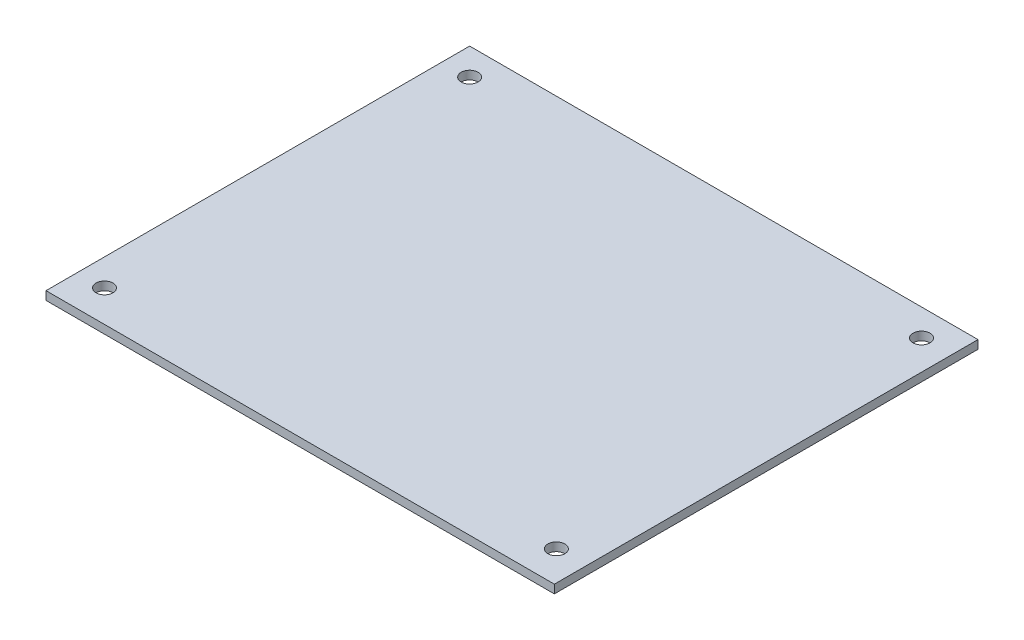
ISO-10303-21;
HEADER;
FILE_DESCRIPTION(('STEP AP214'),'2;1');
FILE_NAME('part.step','',(''),(''),'','','');
FILE_SCHEMA(('AUTOMOTIVE_DESIGN { 1 0 10303 214 1 1 1 1 }'));
ENDSEC;
DATA;
#1=APPLICATION_CONTEXT('core data for automotive mechanical design processes');
#2=APPLICATION_PROTOCOL_DEFINITION('international standard','automotive_design',2000,#1);
#3=PRODUCT_CONTEXT('',#1,'mechanical');
#4=PRODUCT('Part','Part','',(#3));
#5=PRODUCT_RELATED_PRODUCT_CATEGORY('part','',(#4));
#6=PRODUCT_DEFINITION_FORMATION('','',#4);
#7=PRODUCT_DEFINITION_CONTEXT('part definition',#1,'design');
#8=PRODUCT_DEFINITION('design','',#6,#7);
#9=PRODUCT_DEFINITION_SHAPE('','',#8);
#10=(LENGTH_UNIT() NAMED_UNIT(*) SI_UNIT(.MILLI.,.METRE.));
#11=(NAMED_UNIT(*) PLANE_ANGLE_UNIT() SI_UNIT($,.RADIAN.));
#12=(NAMED_UNIT(*) SI_UNIT($,.STERADIAN.) SOLID_ANGLE_UNIT());
#13=UNCERTAINTY_MEASURE_WITH_UNIT(LENGTH_MEASURE(1.E-05),#10,'distance_accuracy_value','');
#14=(GEOMETRIC_REPRESENTATION_CONTEXT(3) GLOBAL_UNCERTAINTY_ASSIGNED_CONTEXT((#13)) GLOBAL_UNIT_ASSIGNED_CONTEXT((#10,
#11,#12)) REPRESENTATION_CONTEXT('',''));
#15=CARTESIAN_POINT('',(0.,0.,0.));
#16=DIRECTION('',(0.,0.,1.));
#17=DIRECTION('',(1.,0.,0.));
#18=AXIS2_PLACEMENT_3D('',#15,#16,#17);
#19=CARTESIAN_POINT('',(0.,1.6,0.));
#20=DIRECTION('',(0.,-1.,0.));
#21=DIRECTION('',(0.,0.,-1.));
#22=AXIS2_PLACEMENT_3D('',#19,#20,#21);
#23=PLANE('',#22);
#24=DIRECTION('',(0.,0.,1.));
#25=VECTOR('',#24,1.);
#26=CARTESIAN_POINT('',(0.,1.6,0.));
#27=LINE('',#26,#25);
#28=CARTESIAN_POINT('',(0.,1.6,-80.));
#29=VERTEX_POINT('',#28);
#30=CARTESIAN_POINT('',(0.,1.6,0.));
#31=VERTEX_POINT('',#30);
#32=EDGE_CURVE('E85',#29,#31,#27,.T.);
#33=ORIENTED_EDGE('',*,*,#32,.T.);
#34=DIRECTION('',(1.,0.,0.));
#35=VECTOR('',#34,1.);
#36=CARTESIAN_POINT('',(0.,1.6,0.));
#37=LINE('',#36,#35);
#38=CARTESIAN_POINT('',(96.,1.6,0.));
#39=VERTEX_POINT('',#38);
#40=EDGE_CURVE('E80',#31,#39,#37,.T.);
#41=ORIENTED_EDGE('',*,*,#40,.T.);
#42=DIRECTION('',(0.,0.,-1.));
#43=VECTOR('',#42,1.);
#44=CARTESIAN_POINT('',(96.,1.6,0.));
#45=LINE('',#44,#43);
#46=CARTESIAN_POINT('',(96.,1.6,-80.));
#47=VERTEX_POINT('',#46);
#48=EDGE_CURVE('E83',#39,#47,#45,.T.);
#49=ORIENTED_EDGE('',*,*,#48,.T.);
#50=DIRECTION('',(-1.,0.,0.));
#51=VECTOR('',#50,1.);
#52=CARTESIAN_POINT('',(0.,1.6,-80.));
#53=LINE('',#52,#51);
#54=EDGE_CURVE('E50',#47,#29,#53,.T.);
#55=ORIENTED_EDGE('',*,*,#54,.T.);
#56=EDGE_LOOP('',(#33,#41,#49,#55));
#57=FACE_BOUND('',#56,.T.);
#58=CARTESIAN_POINT('',(5.08,1.6,-74.92));
#59=DIRECTION('',(0.,1.,0.));
#60=DIRECTION('',(0.,0.,1.));
#61=AXIS2_PLACEMENT_3D('',#58,#59,#60);
#62=CIRCLE('',#61,1.60000000000001);
#63=CARTESIAN_POINT('',(5.08,1.6,-73.32));
#64=VERTEX_POINT('',#63);
#65=EDGE_CURVE('E100',#64,#64,#62,.T.);
#66=ORIENTED_EDGE('',*,*,#65,.F.);
#67=EDGE_LOOP('',(#66));
#68=FACE_BOUND('',#67,.T.);
#69=CARTESIAN_POINT('',(90.412,1.6,-74.92));
#70=DIRECTION('',(0.,1.,0.));
#71=DIRECTION('',(0.,0.,1.));
#72=AXIS2_PLACEMENT_3D('',#69,#70,#71);
#73=CIRCLE('',#72,1.60000000000001);
#74=CARTESIAN_POINT('',(90.412,1.6,-73.32));
#75=VERTEX_POINT('',#74);
#76=EDGE_CURVE('E115',#75,#75,#73,.T.);
#77=ORIENTED_EDGE('',*,*,#76,.F.);
#78=EDGE_LOOP('',(#77));
#79=FACE_BOUND('',#78,.T.);
#80=CARTESIAN_POINT('',(90.412,1.6,-5.969));
#81=DIRECTION('',(0.,1.,0.));
#82=DIRECTION('',(0.,0.,1.));
#83=AXIS2_PLACEMENT_3D('',#80,#81,#82);
#84=CIRCLE('',#83,1.60000000000001);
#85=CARTESIAN_POINT('',(90.412,1.6,-4.369));
#86=VERTEX_POINT('',#85);
#87=EDGE_CURVE('E121',#86,#86,#84,.T.);
#88=ORIENTED_EDGE('',*,*,#87,.F.);
#89=EDGE_LOOP('',(#88));
#90=FACE_BOUND('',#89,.T.);
#91=CARTESIAN_POINT('',(5.08,1.6,-5.969));
#92=DIRECTION('',(0.,1.,0.));
#93=DIRECTION('',(0.,0.,1.));
#94=AXIS2_PLACEMENT_3D('',#91,#92,#93);
#95=CIRCLE('',#94,1.6);
#96=CARTESIAN_POINT('',(5.08,1.6,-4.369));
#97=VERTEX_POINT('',#96);
#98=EDGE_CURVE('E127',#97,#97,#95,.T.);
#99=ORIENTED_EDGE('',*,*,#98,.F.);
#100=EDGE_LOOP('',(#99));
#101=FACE_BOUND('',#100,.T.);
#102=ADVANCED_FACE('F33',(#57,#68,#79,#90,#101),#23,.F.);
#103=CARTESIAN_POINT('',(0.,0.,0.));
#104=DIRECTION('',(0.,-1.,0.));
#105=DIRECTION('',(0.,0.,-1.));
#106=AXIS2_PLACEMENT_3D('',#103,#104,#105);
#107=PLANE('',#106);
#108=CARTESIAN_POINT('',(90.412,0.,-5.969));
#109=DIRECTION('',(0.,1.,0.));
#110=DIRECTION('',(0.,0.,1.));
#111=AXIS2_PLACEMENT_3D('',#108,#109,#110);
#112=CIRCLE('',#111,1.60000000000001);
#113=CARTESIAN_POINT('',(90.412,0.,-4.369));
#114=VERTEX_POINT('',#113);
#115=EDGE_CURVE('E124',#114,#114,#112,.T.);
#116=ORIENTED_EDGE('',*,*,#115,.T.);
#117=EDGE_LOOP('',(#116));
#118=FACE_BOUND('',#117,.T.);
#119=CARTESIAN_POINT('',(5.08,0.,-74.92));
#120=DIRECTION('',(0.,1.,0.));
#121=DIRECTION('',(0.,0.,1.));
#122=AXIS2_PLACEMENT_3D('',#119,#120,#121);
#123=CIRCLE('',#122,1.60000000000001);
#124=CARTESIAN_POINT('',(5.08,0.,-73.32));
#125=VERTEX_POINT('',#124);
#126=EDGE_CURVE('E112',#125,#125,#123,.T.);
#127=ORIENTED_EDGE('',*,*,#126,.T.);
#128=EDGE_LOOP('',(#127));
#129=FACE_BOUND('',#128,.T.);
#130=DIRECTION('',(0.,0.,1.));
#131=VECTOR('',#130,1.);
#132=CARTESIAN_POINT('',(0.,0.,0.));
#133=LINE('',#132,#131);
#134=CARTESIAN_POINT('',(0.,0.,-80.));
#135=VERTEX_POINT('',#134);
#136=CARTESIAN_POINT('',(0.,0.,0.));
#137=VERTEX_POINT('',#136);
#138=EDGE_CURVE('E97',#135,#137,#133,.T.);
#139=ORIENTED_EDGE('',*,*,#138,.F.);
#140=DIRECTION('',(-1.,0.,0.));
#141=VECTOR('',#140,1.);
#142=CARTESIAN_POINT('',(0.,0.,-80.));
#143=LINE('',#142,#141);
#144=CARTESIAN_POINT('',(96.,0.,-80.));
#145=VERTEX_POINT('',#144);
#146=EDGE_CURVE('E73',#145,#135,#143,.T.);
#147=ORIENTED_EDGE('',*,*,#146,.F.);
#148=DIRECTION('',(0.,0.,-1.));
#149=VECTOR('',#148,1.);
#150=CARTESIAN_POINT('',(96.,0.,0.));
#151=LINE('',#150,#149);
#152=CARTESIAN_POINT('',(96.,0.,0.));
#153=VERTEX_POINT('',#152);
#154=EDGE_CURVE('E67',#153,#145,#151,.T.);
#155=ORIENTED_EDGE('',*,*,#154,.F.);
#156=DIRECTION('',(1.,0.,0.));
#157=VECTOR('',#156,1.);
#158=CARTESIAN_POINT('',(0.,0.,0.));
#159=LINE('',#158,#157);
#160=EDGE_CURVE('E89',#137,#153,#159,.T.);
#161=ORIENTED_EDGE('',*,*,#160,.F.);
#162=EDGE_LOOP('',(#139,#147,#155,#161));
#163=FACE_BOUND('',#162,.T.);
#164=CARTESIAN_POINT('',(90.412,0.,-74.92));
#165=DIRECTION('',(0.,1.,0.));
#166=DIRECTION('',(0.,0.,1.));
#167=AXIS2_PLACEMENT_3D('',#164,#165,#166);
#168=CIRCLE('',#167,1.60000000000001);
#169=CARTESIAN_POINT('',(90.412,0.,-73.32));
#170=VERTEX_POINT('',#169);
#171=EDGE_CURVE('E118',#170,#170,#168,.T.);
#172=ORIENTED_EDGE('',*,*,#171,.T.);
#173=EDGE_LOOP('',(#172));
#174=FACE_BOUND('',#173,.T.);
#175=CARTESIAN_POINT('',(5.08,0.,-5.969));
#176=DIRECTION('',(0.,1.,0.));
#177=DIRECTION('',(0.,0.,1.));
#178=AXIS2_PLACEMENT_3D('',#175,#176,#177);
#179=CIRCLE('',#178,1.6);
#180=CARTESIAN_POINT('',(5.08,0.,-4.369));
#181=VERTEX_POINT('',#180);
#182=EDGE_CURVE('E130',#181,#181,#179,.T.);
#183=ORIENTED_EDGE('',*,*,#182,.T.);
#184=EDGE_LOOP('',(#183));
#185=FACE_BOUND('',#184,.T.);
#186=ADVANCED_FACE('F108',(#118,#129,#163,#174,#185),#107,.T.);
#187=CARTESIAN_POINT('',(0.,1.6,0.));
#188=DIRECTION('',(1.,0.,0.));
#189=DIRECTION('',(0.,0.,-1.));
#190=AXIS2_PLACEMENT_3D('',#187,#188,#189);
#191=PLANE('',#190);
#192=ORIENTED_EDGE('',*,*,#138,.T.);
#193=DIRECTION('',(0.,-1.,0.));
#194=VECTOR('',#193,1.);
#195=CARTESIAN_POINT('',(0.,1.6,0.));
#196=LINE('',#195,#194);
#197=EDGE_CURVE('E11',#31,#137,#196,.T.);
#198=ORIENTED_EDGE('',*,*,#197,.F.);
#199=ORIENTED_EDGE('',*,*,#32,.F.);
#200=DIRECTION('',(0.,-1.,0.));
#201=VECTOR('',#200,1.);
#202=CARTESIAN_POINT('',(0.,1.6,-80.));
#203=LINE('',#202,#201);
#204=EDGE_CURVE('E93',#29,#135,#203,.T.);
#205=ORIENTED_EDGE('',*,*,#204,.T.);
#206=EDGE_LOOP('',(#192,#198,#199,#205));
#207=FACE_BOUND('',#206,.T.);
#208=ADVANCED_FACE('F35',(#207),#191,.F.);
#209=CARTESIAN_POINT('',(0.,1.6,0.));
#210=DIRECTION('',(0.,0.,-1.));
#211=DIRECTION('',(-1.,0.,0.));
#212=AXIS2_PLACEMENT_3D('',#209,#210,#211);
#213=PLANE('',#212);
#214=ORIENTED_EDGE('',*,*,#160,.T.);
#215=DIRECTION('',(0.,-1.,0.));
#216=VECTOR('',#215,1.);
#217=CARTESIAN_POINT('',(96.,1.6,0.));
#218=LINE('',#217,#216);
#219=EDGE_CURVE('E42',#39,#153,#218,.T.);
#220=ORIENTED_EDGE('',*,*,#219,.F.);
#221=ORIENTED_EDGE('',*,*,#40,.F.);
#222=ORIENTED_EDGE('',*,*,#197,.T.);
#223=EDGE_LOOP('',(#214,#220,#221,#222));
#224=FACE_BOUND('',#223,.T.);
#225=ADVANCED_FACE('F88',(#224),#213,.F.);
#226=CARTESIAN_POINT('',(96.,1.6,0.));
#227=DIRECTION('',(-1.,0.,0.));
#228=DIRECTION('',(0.,0.,1.));
#229=AXIS2_PLACEMENT_3D('',#226,#227,#228);
#230=PLANE('',#229);
#231=ORIENTED_EDGE('',*,*,#154,.T.);
#232=DIRECTION('',(0.,-1.,0.));
#233=VECTOR('',#232,1.);
#234=CARTESIAN_POINT('',(96.,1.6,-80.));
#235=LINE('',#234,#233);
#236=EDGE_CURVE('E90',#47,#145,#235,.T.);
#237=ORIENTED_EDGE('',*,*,#236,.F.);
#238=ORIENTED_EDGE('',*,*,#48,.F.);
#239=ORIENTED_EDGE('',*,*,#219,.T.);
#240=EDGE_LOOP('',(#231,#237,#238,#239));
#241=FACE_BOUND('',#240,.T.);
#242=ADVANCED_FACE('F91',(#241),#230,.F.);
#243=CARTESIAN_POINT('',(0.,1.6,-80.));
#244=DIRECTION('',(0.,0.,1.));
#245=DIRECTION('',(1.,0.,0.));
#246=AXIS2_PLACEMENT_3D('',#243,#244,#245);
#247=PLANE('',#246);
#248=ORIENTED_EDGE('',*,*,#146,.T.);
#249=ORIENTED_EDGE('',*,*,#204,.F.);
#250=ORIENTED_EDGE('',*,*,#54,.F.);
#251=ORIENTED_EDGE('',*,*,#236,.T.);
#252=EDGE_LOOP('',(#248,#249,#250,#251));
#253=FACE_BOUND('',#252,.T.);
#254=ADVANCED_FACE('F105',(#253),#247,.F.);
#255=CARTESIAN_POINT('',(5.08,1.6,-74.92));
#256=DIRECTION('',(0.,-1.,0.));
#257=DIRECTION('',(0.,0.,-1.));
#258=AXIS2_PLACEMENT_3D('',#255,#256,#257);
#259=CYLINDRICAL_SURFACE('',#258,1.60000000000001);
#260=ORIENTED_EDGE('',*,*,#65,.T.);
#261=EDGE_LOOP('',(#260));
#262=FACE_BOUND('',#261,.T.);
#263=ORIENTED_EDGE('',*,*,#126,.F.);
#264=EDGE_LOOP('',(#263));
#265=FACE_BOUND('',#264,.T.);
#266=ADVANCED_FACE('F147',(#262,#265),#259,.F.);
#267=CARTESIAN_POINT('',(90.412,1.6,-74.92));
#268=DIRECTION('',(0.,-1.,0.));
#269=DIRECTION('',(0.,0.,-1.));
#270=AXIS2_PLACEMENT_3D('',#267,#268,#269);
#271=CYLINDRICAL_SURFACE('',#270,1.60000000000001);
#272=ORIENTED_EDGE('',*,*,#76,.T.);
#273=EDGE_LOOP('',(#272));
#274=FACE_BOUND('',#273,.T.);
#275=ORIENTED_EDGE('',*,*,#171,.F.);
#276=EDGE_LOOP('',(#275));
#277=FACE_BOUND('',#276,.T.);
#278=ADVANCED_FACE('F193',(#274,#277),#271,.F.);
#279=CARTESIAN_POINT('',(90.412,1.6,-5.969));
#280=DIRECTION('',(0.,-1.,0.));
#281=DIRECTION('',(0.,0.,-1.));
#282=AXIS2_PLACEMENT_3D('',#279,#280,#281);
#283=CYLINDRICAL_SURFACE('',#282,1.60000000000001);
#284=ORIENTED_EDGE('',*,*,#87,.T.);
#285=EDGE_LOOP('',(#284));
#286=FACE_BOUND('',#285,.T.);
#287=ORIENTED_EDGE('',*,*,#115,.F.);
#288=EDGE_LOOP('',(#287));
#289=FACE_BOUND('',#288,.T.);
#290=ADVANCED_FACE('F201',(#286,#289),#283,.F.);
#291=CARTESIAN_POINT('',(5.08,1.6,-5.969));
#292=DIRECTION('',(0.,-1.,0.));
#293=DIRECTION('',(0.,0.,-1.));
#294=AXIS2_PLACEMENT_3D('',#291,#292,#293);
#295=CYLINDRICAL_SURFACE('',#294,1.6);
#296=ORIENTED_EDGE('',*,*,#98,.T.);
#297=EDGE_LOOP('',(#296));
#298=FACE_BOUND('',#297,.T.);
#299=ORIENTED_EDGE('',*,*,#182,.F.);
#300=EDGE_LOOP('',(#299));
#301=FACE_BOUND('',#300,.T.);
#302=ADVANCED_FACE('F136',(#298,#301),#295,.F.);
#303=CLOSED_SHELL('',(#102,#186,#208,#225,#242,#254,#266,#278,#290,#302));
#304=MANIFOLD_SOLID_BREP('B2',#303);
#305=ADVANCED_BREP_SHAPE_REPRESENTATION('',(#18,#304),#14);
#306=SHAPE_DEFINITION_REPRESENTATION(#9,#305);
ENDSEC;
END-ISO-10303-21;
